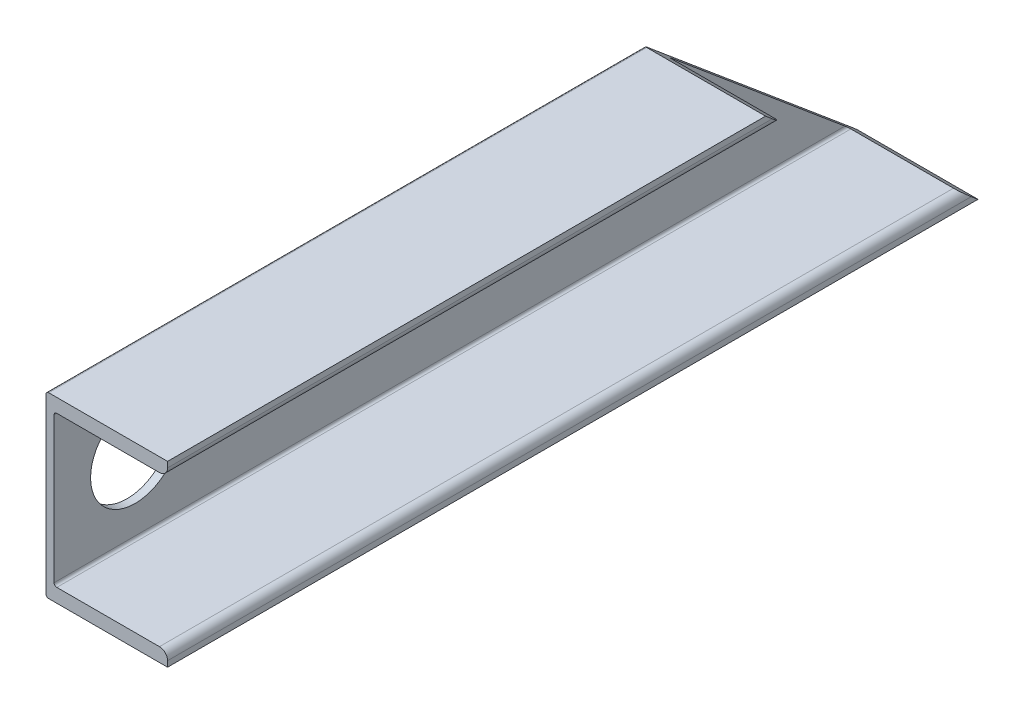
ISO-10303-21;
HEADER;
FILE_DESCRIPTION(('STEP AP214'),'2;1');
FILE_NAME('part.step','',(''),(''),'','','');
FILE_SCHEMA(('AUTOMOTIVE_DESIGN { 1 0 10303 214 1 1 1 1 }'));
ENDSEC;
DATA;
#1=APPLICATION_CONTEXT('core data for automotive mechanical design processes');
#2=APPLICATION_PROTOCOL_DEFINITION('international standard','automotive_design',2000,#1);
#3=PRODUCT_CONTEXT('',#1,'mechanical');
#4=PRODUCT('Part','Part','',(#3));
#5=PRODUCT_RELATED_PRODUCT_CATEGORY('part','',(#4));
#6=PRODUCT_DEFINITION_FORMATION('','',#4);
#7=PRODUCT_DEFINITION_CONTEXT('part definition',#1,'design');
#8=PRODUCT_DEFINITION('design','',#6,#7);
#9=PRODUCT_DEFINITION_SHAPE('','',#8);
#10=(LENGTH_UNIT() NAMED_UNIT(*) SI_UNIT(.MILLI.,.METRE.));
#11=(NAMED_UNIT(*) PLANE_ANGLE_UNIT() SI_UNIT($,.RADIAN.));
#12=(NAMED_UNIT(*) SI_UNIT($,.STERADIAN.) SOLID_ANGLE_UNIT());
#13=UNCERTAINTY_MEASURE_WITH_UNIT(LENGTH_MEASURE(1.E-05),#10,'distance_accuracy_value','');
#14=(GEOMETRIC_REPRESENTATION_CONTEXT(3) GLOBAL_UNCERTAINTY_ASSIGNED_CONTEXT((#13)) GLOBAL_UNIT_ASSIGNED_CONTEXT((#10,
#11,#12)) REPRESENTATION_CONTEXT('',''));
#15=CARTESIAN_POINT('',(0.,0.,0.));
#16=DIRECTION('',(0.,0.,1.));
#17=DIRECTION('',(1.,0.,0.));
#18=AXIS2_PLACEMENT_3D('',#15,#16,#17);
#19=CARTESIAN_POINT('',(3.00000000000002,-27.9,300.));
#20=DIRECTION('',(-1.,0.,0.));
#21=DIRECTION('',(0.,0.,1.));
#22=AXIS2_PLACEMENT_3D('',#19,#20,#21);
#23=PLANE('',#22);
#24=CARTESIAN_POINT('',(3.00000000000002,0.,270.));
#25=DIRECTION('',(-1.,0.,0.));
#26=DIRECTION('',(0.,0.,1.));
#27=AXIS2_PLACEMENT_3D('',#24,#25,#26);
#28=CIRCLE('',#27,16.5);
#29=CARTESIAN_POINT('',(3.00000000000002,0.,286.5));
#30=VERTEX_POINT('',#29);
#31=EDGE_CURVE('E165',#30,#30,#28,.T.);
#32=ORIENTED_EDGE('',*,*,#31,.T.);
#33=EDGE_LOOP('',(#32));
#34=FACE_BOUND('',#33,.T.);
#35=DIRECTION('',(0.,1.,0.));
#36=VECTOR('',#35,1.);
#37=CARTESIAN_POINT('',(3.00000000000002,-27.9,300.));
#38=LINE('',#37,#36);
#39=CARTESIAN_POINT('',(3.00000000000002,-26.9,300.));
#40=VERTEX_POINT('',#39);
#41=CARTESIAN_POINT('',(3.00000000000002,26.9,300.));
#42=VERTEX_POINT('',#41);
#43=EDGE_CURVE('E241',#40,#42,#38,.T.);
#44=ORIENTED_EDGE('',*,*,#43,.F.);
#45=DIRECTION('',(0.,0.,-1.));
#46=VECTOR('',#45,1.);
#47=CARTESIAN_POINT('',(3.00000000000002,-26.9,6.07794332223038));
#48=LINE('',#47,#46);
#49=CARTESIAN_POINT('',(3.00000000000002,-26.9,7.26969691482457));
#50=VERTEX_POINT('',#49);
#51=EDGE_CURVE('E195',#40,#50,#48,.T.);
#52=ORIENTED_EDGE('',*,*,#51,.T.);
#53=DIRECTION('',(0.,-0.642787609686544,-0.766044443118975));
#54=VECTOR('',#53,1.);
#55=CARTESIAN_POINT('',(3.00000000000002,33.,78.655737111217));
#56=LINE('',#55,#54);
#57=CARTESIAN_POINT('',(3.00000000000002,26.9,71.3860401963924));
#58=VERTEX_POINT('',#57);
#59=EDGE_CURVE('E225',#58,#50,#56,.T.);
#60=ORIENTED_EDGE('',*,*,#59,.F.);
#61=DIRECTION('',(0.,0.,-1.));
#62=VECTOR('',#61,1.);
#63=CARTESIAN_POINT('',(3.00000000000002,26.9,300.));
#64=LINE('',#63,#62);
#65=EDGE_CURVE('E193',#58,#42,#64,.F.);
#66=ORIENTED_EDGE('',*,*,#65,.T.);
#67=EDGE_LOOP('',(#44,#52,#60,#66));
#68=FACE_BOUND('',#67,.T.);
#69=ADVANCED_FACE('F44',(#34,#68),#23,.F.);
#70=CARTESIAN_POINT('',(3.00000000000002,27.9,300.));
#71=DIRECTION('',(0.,1.,0.));
#72=DIRECTION('',(0.,0.,1.));
#73=AXIS2_PLACEMENT_3D('',#70,#71,#72);
#74=PLANE('',#73);
#75=DIRECTION('',(1.,0.,0.));
#76=VECTOR('',#75,1.);
#77=CARTESIAN_POINT('',(3.00000000000002,27.9,300.));
#78=LINE('',#77,#76);
#79=CARTESIAN_POINT('',(4.00000000000002,27.9,300.));
#80=VERTEX_POINT('',#79);
#81=CARTESIAN_POINT('',(42.,27.9,300.));
#82=VERTEX_POINT('',#81);
#83=EDGE_CURVE('E238',#80,#82,#78,.T.);
#84=ORIENTED_EDGE('',*,*,#83,.F.);
#85=DIRECTION('',(0.,0.,-1.));
#86=VECTOR('',#85,1.);
#87=CARTESIAN_POINT('',(4.00000000000002,27.9,72.5777937889866));
#88=LINE('',#87,#86);
#89=CARTESIAN_POINT('',(4.00000000000002,27.9,72.5777937889866));
#90=VERTEX_POINT('',#89);
#91=EDGE_CURVE('E216',#80,#90,#88,.T.);
#92=ORIENTED_EDGE('',*,*,#91,.T.);
#93=DIRECTION('',(-1.,0.,0.));
#94=VECTOR('',#93,1.);
#95=CARTESIAN_POINT('',(45.001,27.9,72.5777937889866));
#96=LINE('',#95,#94);
#97=CARTESIAN_POINT('',(42.,27.9,72.5777937889866));
#98=VERTEX_POINT('',#97);
#99=EDGE_CURVE('E227',#98,#90,#96,.T.);
#100=ORIENTED_EDGE('',*,*,#99,.F.);
#101=DIRECTION('',(0.,0.,-1.));
#102=VECTOR('',#101,1.);
#103=CARTESIAN_POINT('',(42.,27.9,300.));
#104=LINE('',#103,#102);
#105=EDGE_CURVE('E190',#98,#82,#104,.F.);
#106=ORIENTED_EDGE('',*,*,#105,.T.);
#107=EDGE_LOOP('',(#84,#92,#100,#106));
#108=FACE_BOUND('',#107,.T.);
#109=ADVANCED_FACE('F236',(#108),#74,.F.);
#110=CARTESIAN_POINT('',(45.,27.9,300.));
#111=DIRECTION('',(-1.,0.,0.));
#112=DIRECTION('',(0.,0.,1.));
#113=AXIS2_PLACEMENT_3D('',#110,#111,#112);
#114=PLANE('',#113);
#115=DIRECTION('',(0.,1.,0.));
#116=VECTOR('',#115,1.);
#117=CARTESIAN_POINT('',(45.,27.9,300.));
#118=LINE('',#117,#116);
#119=CARTESIAN_POINT('',(45.,30.9,300.));
#120=VERTEX_POINT('',#119);
#121=CARTESIAN_POINT('',(45.,33.,300.));
#122=VERTEX_POINT('',#121);
#123=EDGE_CURVE('E240',#120,#122,#118,.T.);
#124=ORIENTED_EDGE('',*,*,#123,.F.);
#125=DIRECTION('',(0.,0.,-1.));
#126=VECTOR('',#125,1.);
#127=CARTESIAN_POINT('',(45.,30.9,300.));
#128=LINE('',#127,#126);
#129=CARTESIAN_POINT('',(45.,30.9,76.1530545667692));
#130=VERTEX_POINT('',#129);
#131=EDGE_CURVE('E163',#120,#130,#128,.T.);
#132=ORIENTED_EDGE('',*,*,#131,.T.);
#133=DIRECTION('',(0.,-0.642787609686544,-0.766044443118975));
#134=VECTOR('',#133,1.);
#135=CARTESIAN_POINT('',(45.,33.,78.655737111217));
#136=LINE('',#135,#134);
#137=CARTESIAN_POINT('',(45.,33.,78.655737111217));
#138=VERTEX_POINT('',#137);
#139=EDGE_CURVE('E149',#138,#130,#136,.T.);
#140=ORIENTED_EDGE('',*,*,#139,.F.);
#141=DIRECTION('',(0.,0.,-1.));
#142=VECTOR('',#141,1.);
#143=CARTESIAN_POINT('',(45.,33.,300.));
#144=LINE('',#143,#142);
#145=EDGE_CURVE('E161',#122,#138,#144,.T.);
#146=ORIENTED_EDGE('',*,*,#145,.F.);
#147=EDGE_LOOP('',(#124,#132,#140,#146));
#148=FACE_BOUND('',#147,.T.);
#149=ADVANCED_FACE('F160',(#148),#114,.F.);
#150=CARTESIAN_POINT('',(0.,33.,300.));
#151=DIRECTION('',(0.,-1.,0.));
#152=DIRECTION('',(0.,0.,-1.));
#153=AXIS2_PLACEMENT_3D('',#150,#151,#152);
#154=PLANE('',#153);
#155=DIRECTION('',(-1.,0.,0.));
#156=VECTOR('',#155,1.);
#157=CARTESIAN_POINT('',(45.001,33.,78.655737111217));
#158=LINE('',#157,#156);
#159=CARTESIAN_POINT('',(0.999999999999987,33.,78.655737111217));
#160=VERTEX_POINT('',#159);
#161=EDGE_CURVE('E145',#138,#160,#158,.T.);
#162=ORIENTED_EDGE('',*,*,#161,.T.);
#163=DIRECTION('',(0.,0.,-1.));
#164=VECTOR('',#163,1.);
#165=CARTESIAN_POINT('',(0.99999999999999,33.,300.));
#166=LINE('',#165,#164);
#167=CARTESIAN_POINT('',(0.99999999999999,33.,300.));
#168=VERTEX_POINT('',#167);
#169=EDGE_CURVE('E59',#160,#168,#166,.F.);
#170=ORIENTED_EDGE('',*,*,#169,.T.);
#171=DIRECTION('',(-1.,0.,0.));
#172=VECTOR('',#171,1.);
#173=CARTESIAN_POINT('',(0.,33.,300.));
#174=LINE('',#173,#172);
#175=EDGE_CURVE('E168',#122,#168,#174,.T.);
#176=ORIENTED_EDGE('',*,*,#175,.F.);
#177=ORIENTED_EDGE('',*,*,#145,.T.);
#178=EDGE_LOOP('',(#162,#170,#176,#177));
#179=FACE_BOUND('',#178,.T.);
#180=ADVANCED_FACE('F167',(#179),#154,.F.);
#181=CARTESIAN_POINT('',(0.,33.,300.));
#182=DIRECTION('',(1.,0.,0.));
#183=DIRECTION('',(0.,1.,0.));
#184=AXIS2_PLACEMENT_3D('',#181,#182,#183);
#185=PLANE('',#184);
#186=CARTESIAN_POINT('',(0.,0.,270.));
#187=DIRECTION('',(-1.,0.,0.));
#188=DIRECTION('',(0.,-1.,0.));
#189=AXIS2_PLACEMENT_3D('',#186,#187,#188);
#190=CIRCLE('',#189,16.5);
#191=CARTESIAN_POINT('',(0.,-16.5,270.));
#192=VERTEX_POINT('',#191);
#193=EDGE_CURVE('E477',#192,#192,#190,.T.);
#194=ORIENTED_EDGE('',*,*,#193,.F.);
#195=EDGE_LOOP('',(#194));
#196=FACE_BOUND('',#195,.T.);
#197=DIRECTION('',(0.,0.642787609686544,0.766044443118975));
#198=VECTOR('',#197,1.);
#199=CARTESIAN_POINT('',(0.,33.,78.655737111217));
#200=LINE('',#199,#198);
#201=CARTESIAN_POINT('',(0.,-32.,1.19175359259419));
#202=VERTEX_POINT('',#201);
#203=CARTESIAN_POINT('',(0.,32.,77.4639835186228));
#204=VERTEX_POINT('',#203);
#205=EDGE_CURVE('E154',#202,#204,#200,.T.);
#206=ORIENTED_EDGE('',*,*,#205,.F.);
#207=DIRECTION('',(0.,0.,-1.));
#208=VECTOR('',#207,1.);
#209=CARTESIAN_POINT('',(0.,-32.,300.));
#210=LINE('',#209,#208);
#211=CARTESIAN_POINT('',(0.,-32.,300.));
#212=VERTEX_POINT('',#211);
#213=EDGE_CURVE('E209',#202,#212,#210,.F.);
#214=ORIENTED_EDGE('',*,*,#213,.T.);
#215=DIRECTION('',(0.,-1.,0.));
#216=VECTOR('',#215,1.);
#217=CARTESIAN_POINT('',(0.,33.,300.));
#218=LINE('',#217,#216);
#219=CARTESIAN_POINT('',(0.,32.,300.));
#220=VERTEX_POINT('',#219);
#221=EDGE_CURVE('E247',#220,#212,#218,.T.);
#222=ORIENTED_EDGE('',*,*,#221,.F.);
#223=DIRECTION('',(0.,0.,-1.));
#224=VECTOR('',#223,1.);
#225=CARTESIAN_POINT('',(0.,32.,300.));
#226=LINE('',#225,#224);
#227=EDGE_CURVE('E206',#220,#204,#226,.T.);
#228=ORIENTED_EDGE('',*,*,#227,.T.);
#229=EDGE_LOOP('',(#206,#214,#222,#228));
#230=FACE_BOUND('',#229,.T.);
#231=ADVANCED_FACE('F290',(#196,#230),#185,.F.);
#232=CARTESIAN_POINT('',(0.,-33.,300.));
#233=DIRECTION('',(0.,1.,0.));
#234=DIRECTION('',(0.,0.,1.));
#235=AXIS2_PLACEMENT_3D('',#232,#233,#234);
#236=PLANE('',#235);
#237=DIRECTION('',(1.,0.,0.));
#238=VECTOR('',#237,1.);
#239=CARTESIAN_POINT('',(0.,-33.,300.));
#240=LINE('',#239,#238);
#241=CARTESIAN_POINT('',(1.00000000000001,-33.,300.));
#242=VERTEX_POINT('',#241);
#243=CARTESIAN_POINT('',(45.,-33.,300.));
#244=VERTEX_POINT('',#243);
#245=EDGE_CURVE('E250',#242,#244,#240,.T.);
#246=ORIENTED_EDGE('',*,*,#245,.F.);
#247=DIRECTION('',(0.,0.,-1.));
#248=VECTOR('',#247,1.);
#249=CARTESIAN_POINT('',(1.00000000000001,-33.,300.));
#250=LINE('',#249,#248);
#251=CARTESIAN_POINT('',(1.00000000000001,-33.,0.));
#252=VERTEX_POINT('',#251);
#253=EDGE_CURVE('E200',#242,#252,#250,.T.);
#254=ORIENTED_EDGE('',*,*,#253,.T.);
#255=DIRECTION('',(1.,0.,0.));
#256=VECTOR('',#255,1.);
#257=CARTESIAN_POINT('',(0.,-33.,0.));
#258=LINE('',#257,#256);
#259=CARTESIAN_POINT('',(45.,-33.,0.));
#260=VERTEX_POINT('',#259);
#261=EDGE_CURVE('E153',#252,#260,#258,.T.);
#262=ORIENTED_EDGE('',*,*,#261,.T.);
#263=DIRECTION('',(0.,0.,-1.));
#264=VECTOR('',#263,1.);
#265=CARTESIAN_POINT('',(45.,-33.,300.));
#266=LINE('',#265,#264);
#267=EDGE_CURVE('E170',#244,#260,#266,.T.);
#268=ORIENTED_EDGE('',*,*,#267,.F.);
#269=EDGE_LOOP('',(#246,#254,#262,#268));
#270=FACE_BOUND('',#269,.T.);
#271=ADVANCED_FACE('F260',(#270),#236,.F.);
#272=CARTESIAN_POINT('',(45.,-33.,300.));
#273=DIRECTION('',(-1.,0.,0.));
#274=DIRECTION('',(0.,0.,1.));
#275=AXIS2_PLACEMENT_3D('',#272,#273,#274);
#276=PLANE('',#275);
#277=DIRECTION('',(0.,-0.642787609686544,-0.766044443118975));
#278=VECTOR('',#277,1.);
#279=CARTESIAN_POINT('',(45.,33.,78.655737111217));
#280=LINE('',#279,#278);
#281=CARTESIAN_POINT('',(45.,-30.9,2.50268254444778));
#282=VERTEX_POINT('',#281);
#283=EDGE_CURVE('E264',#282,#260,#280,.T.);
#284=ORIENTED_EDGE('',*,*,#283,.F.);
#285=DIRECTION('',(0.,0.,-1.));
#286=VECTOR('',#285,1.);
#287=CARTESIAN_POINT('',(45.,-30.9,300.));
#288=LINE('',#287,#286);
#289=CARTESIAN_POINT('',(45.,-30.9,300.));
#290=VERTEX_POINT('',#289);
#291=EDGE_CURVE('E183',#282,#290,#288,.F.);
#292=ORIENTED_EDGE('',*,*,#291,.T.);
#293=DIRECTION('',(0.,1.,0.));
#294=VECTOR('',#293,1.);
#295=CARTESIAN_POINT('',(45.,-33.,300.));
#296=LINE('',#295,#294);
#297=EDGE_CURVE('E252',#244,#290,#296,.T.);
#298=ORIENTED_EDGE('',*,*,#297,.F.);
#299=ORIENTED_EDGE('',*,*,#267,.T.);
#300=EDGE_LOOP('',(#284,#292,#298,#299));
#301=FACE_BOUND('',#300,.T.);
#302=ADVANCED_FACE('F269',(#301),#276,.F.);
#303=CARTESIAN_POINT('',(45.,-27.9,300.));
#304=DIRECTION('',(0.,-1.,0.));
#305=DIRECTION('',(0.,0.,-1.));
#306=AXIS2_PLACEMENT_3D('',#303,#304,#305);
#307=PLANE('',#306);
#308=DIRECTION('',(1.,0.,0.));
#309=VECTOR('',#308,1.);
#310=CARTESIAN_POINT('',(45.001,-27.9,6.07794332223041));
#311=LINE('',#310,#309);
#312=CARTESIAN_POINT('',(4.00000000000002,-27.9,6.07794332223041));
#313=VERTEX_POINT('',#312);
#314=CARTESIAN_POINT('',(42.,-27.9,6.07794332223041));
#315=VERTEX_POINT('',#314);
#316=EDGE_CURVE('E164',#313,#315,#311,.T.);
#317=ORIENTED_EDGE('',*,*,#316,.F.);
#318=DIRECTION('',(0.,0.,-1.));
#319=VECTOR('',#318,1.);
#320=CARTESIAN_POINT('',(4.00000000000002,-27.9,300.));
#321=LINE('',#320,#319);
#322=CARTESIAN_POINT('',(4.00000000000002,-27.9,300.));
#323=VERTEX_POINT('',#322);
#324=EDGE_CURVE('E198',#313,#323,#321,.F.);
#325=ORIENTED_EDGE('',*,*,#324,.T.);
#326=DIRECTION('',(-1.,0.,0.));
#327=VECTOR('',#326,1.);
#328=CARTESIAN_POINT('',(45.,-27.9,300.));
#329=LINE('',#328,#327);
#330=CARTESIAN_POINT('',(42.,-27.9,300.));
#331=VERTEX_POINT('',#330);
#332=EDGE_CURVE('E176',#331,#323,#329,.T.);
#333=ORIENTED_EDGE('',*,*,#332,.F.);
#334=DIRECTION('',(0.,0.,-1.));
#335=VECTOR('',#334,1.);
#336=CARTESIAN_POINT('',(42.,-27.9,300.));
#337=LINE('',#336,#335);
#338=EDGE_CURVE('E169',#331,#315,#337,.T.);
#339=ORIENTED_EDGE('',*,*,#338,.T.);
#340=EDGE_LOOP('',(#317,#325,#333,#339));
#341=FACE_BOUND('',#340,.T.);
#342=ADVANCED_FACE('F278',(#341),#307,.F.);
#343=CARTESIAN_POINT('',(0.,0.,300.));
#344=DIRECTION('',(0.,0.,-1.));
#345=DIRECTION('',(-1.,0.,0.));
#346=AXIS2_PLACEMENT_3D('',#343,#344,#345);
#347=PLANE('',#346);
#348=ORIENTED_EDGE('',*,*,#221,.T.);
#349=CARTESIAN_POINT('',(1.00000000000001,-32.,300.));
#350=DIRECTION('',(0.,0.,-1.));
#351=DIRECTION('',(-1.,0.,0.));
#352=AXIS2_PLACEMENT_3D('',#349,#350,#351);
#353=CIRCLE('',#352,1.);
#354=EDGE_CURVE('E213',#212,#242,#353,.F.);
#355=ORIENTED_EDGE('',*,*,#354,.T.);
#356=ORIENTED_EDGE('',*,*,#245,.T.);
#357=ORIENTED_EDGE('',*,*,#297,.T.);
#358=CARTESIAN_POINT('',(42.,-30.9,300.));
#359=DIRECTION('',(0.,0.,-1.));
#360=DIRECTION('',(-1.,0.,0.));
#361=AXIS2_PLACEMENT_3D('',#358,#359,#360);
#362=CIRCLE('',#361,3.);
#363=EDGE_CURVE('E187',#290,#331,#362,.F.);
#364=ORIENTED_EDGE('',*,*,#363,.T.);
#365=ORIENTED_EDGE('',*,*,#332,.T.);
#366=CARTESIAN_POINT('',(4.00000000000002,-26.9,300.));
#367=DIRECTION('',(0.,0.,-1.));
#368=DIRECTION('',(-1.,0.,0.));
#369=AXIS2_PLACEMENT_3D('',#366,#367,#368);
#370=CIRCLE('',#369,1.);
#371=EDGE_CURVE('E221',#323,#40,#370,.T.);
#372=ORIENTED_EDGE('',*,*,#371,.T.);
#373=ORIENTED_EDGE('',*,*,#43,.T.);
#374=CARTESIAN_POINT('',(4.00000000000002,26.9,300.));
#375=DIRECTION('',(0.,0.,-1.));
#376=DIRECTION('',(-1.,0.,0.));
#377=AXIS2_PLACEMENT_3D('',#374,#375,#376);
#378=CIRCLE('',#377,1.);
#379=EDGE_CURVE('E11',#42,#80,#378,.T.);
#380=ORIENTED_EDGE('',*,*,#379,.T.);
#381=ORIENTED_EDGE('',*,*,#83,.T.);
#382=CARTESIAN_POINT('',(42.,30.9,300.));
#383=DIRECTION('',(0.,0.,-1.));
#384=DIRECTION('',(-1.,0.,0.));
#385=AXIS2_PLACEMENT_3D('',#382,#383,#384);
#386=CIRCLE('',#385,3.);
#387=EDGE_CURVE('E185',#82,#120,#386,.F.);
#388=ORIENTED_EDGE('',*,*,#387,.T.);
#389=ORIENTED_EDGE('',*,*,#123,.T.);
#390=ORIENTED_EDGE('',*,*,#175,.T.);
#391=CARTESIAN_POINT('',(0.99999999999999,32.,300.));
#392=DIRECTION('',(0.,0.,-1.));
#393=DIRECTION('',(-1.,0.,0.));
#394=AXIS2_PLACEMENT_3D('',#391,#392,#393);
#395=CIRCLE('',#394,1.);
#396=EDGE_CURVE('E211',#168,#220,#395,.F.);
#397=ORIENTED_EDGE('',*,*,#396,.T.);
#398=EDGE_LOOP('',(#348,#355,#356,#357,#364,#365,#372,#373,#380,#381,#388,#389,#390,#397));
#399=FACE_BOUND('',#398,.T.);
#400=ADVANCED_FACE('F271',(#399),#347,.F.);
#401=CARTESIAN_POINT('',(45.001,33.,78.655737111217));
#402=DIRECTION('',(0.,-0.766044443118974,0.642787609686543));
#403=DIRECTION('',(0.,-0.642787609686544,-0.766044443118975));
#404=AXIS2_PLACEMENT_3D('',#401,#402,#403);
#405=PLANE('',#404);
#406=ORIENTED_EDGE('',*,*,#261,.F.);
#407=CARTESIAN_POINT('',(1.00000000000001,-32.,1.19175359259421));
#408=DIRECTION('',(0.,-0.766044443118974,0.642787609686543));
#409=DIRECTION('',(0.,-0.642787609686544,-0.766044443118975));
#410=AXIS2_PLACEMENT_3D('',#407,#408,#409);
#411=ELLIPSE('',#410,1.5557238268604,1.);
#412=EDGE_CURVE('E204',#252,#202,#411,.F.);
#413=ORIENTED_EDGE('',*,*,#412,.T.);
#414=ORIENTED_EDGE('',*,*,#205,.T.);
#415=CARTESIAN_POINT('',(0.99999999999999,32.,77.4639835186228));
#416=DIRECTION('',(0.,-0.766044443118974,0.642787609686543));
#417=DIRECTION('',(0.,-0.642787609686544,-0.766044443118975));
#418=AXIS2_PLACEMENT_3D('',#415,#416,#417);
#419=ELLIPSE('',#418,1.5557238268604,1.);
#420=EDGE_CURVE('E151',#204,#160,#419,.F.);
#421=ORIENTED_EDGE('',*,*,#420,.T.);
#422=ORIENTED_EDGE('',*,*,#161,.F.);
#423=ORIENTED_EDGE('',*,*,#139,.T.);
#424=CARTESIAN_POINT('',(42.,30.9,76.1530545667692));
#425=DIRECTION('',(0.,-0.766044443118974,0.642787609686543));
#426=DIRECTION('',(0.,-0.642787609686544,-0.766044443118975));
#427=AXIS2_PLACEMENT_3D('',#424,#425,#426);
#428=ELLIPSE('',#427,4.66717148058121,3.);
#429=EDGE_CURVE('E173',#130,#98,#428,.F.);
#430=ORIENTED_EDGE('',*,*,#429,.T.);
#431=ORIENTED_EDGE('',*,*,#99,.T.);
#432=CARTESIAN_POINT('',(4.00000000000002,26.9,71.3860401963924));
#433=DIRECTION('',(0.,-0.766044443118974,0.642787609686543));
#434=DIRECTION('',(0.,0.642787609686544,0.766044443118975));
#435=AXIS2_PLACEMENT_3D('',#432,#433,#434);
#436=ELLIPSE('',#435,1.5557238268604,1.);
#437=EDGE_CURVE('E52',#90,#58,#436,.T.);
#438=ORIENTED_EDGE('',*,*,#437,.T.);
#439=ORIENTED_EDGE('',*,*,#59,.T.);
#440=CARTESIAN_POINT('',(4.00000000000002,-26.9,7.2696969148246));
#441=DIRECTION('',(0.,-0.766044443118974,0.642787609686543));
#442=DIRECTION('',(0.,0.642787609686544,0.766044443118975));
#443=AXIS2_PLACEMENT_3D('',#440,#441,#442);
#444=ELLIPSE('',#443,1.5557238268604,1.);
#445=EDGE_CURVE('E219',#50,#313,#444,.T.);
#446=ORIENTED_EDGE('',*,*,#445,.T.);
#447=ORIENTED_EDGE('',*,*,#316,.T.);
#448=CARTESIAN_POINT('',(42.,-30.9,2.5026825444478));
#449=DIRECTION('',(0.,-0.766044443118974,0.642787609686543));
#450=DIRECTION('',(0.,-0.642787609686544,-0.766044443118975));
#451=AXIS2_PLACEMENT_3D('',#448,#449,#450);
#452=ELLIPSE('',#451,4.66717148058121,3.);
#453=EDGE_CURVE('E181',#315,#282,#452,.F.);
#454=ORIENTED_EDGE('',*,*,#453,.T.);
#455=ORIENTED_EDGE('',*,*,#283,.T.);
#456=EDGE_LOOP('',(#406,#413,#414,#421,#422,#423,#430,#431,#438,#439,#446,#447,#454,#455));
#457=FACE_BOUND('',#456,.T.);
#458=ADVANCED_FACE('F148',(#457),#405,.F.);
#459=CARTESIAN_POINT('',(42.,-30.9,300.));
#460=DIRECTION('',(0.,0.,-1.));
#461=DIRECTION('',(-1.,0.,0.));
#462=AXIS2_PLACEMENT_3D('',#459,#460,#461);
#463=CYLINDRICAL_SURFACE('',#462,3.);
#464=ORIENTED_EDGE('',*,*,#363,.F.);
#465=ORIENTED_EDGE('',*,*,#291,.F.);
#466=ORIENTED_EDGE('',*,*,#453,.F.);
#467=ORIENTED_EDGE('',*,*,#338,.F.);
#468=EDGE_LOOP('',(#464,#465,#466,#467));
#469=FACE_BOUND('',#468,.T.);
#470=ADVANCED_FACE('F275',(#469),#463,.T.);
#471=CARTESIAN_POINT('',(42.,30.9,300.));
#472=DIRECTION('',(0.,0.,-1.));
#473=DIRECTION('',(-1.,0.,0.));
#474=AXIS2_PLACEMENT_3D('',#471,#472,#473);
#475=CYLINDRICAL_SURFACE('',#474,3.);
#476=ORIENTED_EDGE('',*,*,#387,.F.);
#477=ORIENTED_EDGE('',*,*,#105,.F.);
#478=ORIENTED_EDGE('',*,*,#429,.F.);
#479=ORIENTED_EDGE('',*,*,#131,.F.);
#480=EDGE_LOOP('',(#476,#477,#478,#479));
#481=FACE_BOUND('',#480,.T.);
#482=ADVANCED_FACE('F318',(#481),#475,.T.);
#483=CARTESIAN_POINT('',(4.00000000000002,-26.9,300.));
#484=DIRECTION('',(0.,0.,1.));
#485=DIRECTION('',(1.,0.,0.));
#486=AXIS2_PLACEMENT_3D('',#483,#484,#485);
#487=CYLINDRICAL_SURFACE('',#486,1.);
#488=ORIENTED_EDGE('',*,*,#371,.F.);
#489=ORIENTED_EDGE('',*,*,#324,.F.);
#490=ORIENTED_EDGE('',*,*,#445,.F.);
#491=ORIENTED_EDGE('',*,*,#51,.F.);
#492=EDGE_LOOP('',(#488,#489,#490,#491));
#493=FACE_BOUND('',#492,.T.);
#494=ADVANCED_FACE('F282',(#493),#487,.F.);
#495=CARTESIAN_POINT('',(1.00000000000001,-32.,300.));
#496=DIRECTION('',(0.,0.,-1.));
#497=DIRECTION('',(-1.,0.,0.));
#498=AXIS2_PLACEMENT_3D('',#495,#496,#497);
#499=CYLINDRICAL_SURFACE('',#498,1.);
#500=ORIENTED_EDGE('',*,*,#354,.F.);
#501=ORIENTED_EDGE('',*,*,#213,.F.);
#502=ORIENTED_EDGE('',*,*,#412,.F.);
#503=ORIENTED_EDGE('',*,*,#253,.F.);
#504=EDGE_LOOP('',(#500,#501,#502,#503));
#505=FACE_BOUND('',#504,.T.);
#506=ADVANCED_FACE('F295',(#505),#499,.T.);
#507=CARTESIAN_POINT('',(0.99999999999999,32.,300.));
#508=DIRECTION('',(0.,0.,-1.));
#509=DIRECTION('',(-1.,0.,0.));
#510=AXIS2_PLACEMENT_3D('',#507,#508,#509);
#511=CYLINDRICAL_SURFACE('',#510,1.);
#512=ORIENTED_EDGE('',*,*,#396,.F.);
#513=ORIENTED_EDGE('',*,*,#169,.F.);
#514=ORIENTED_EDGE('',*,*,#420,.F.);
#515=ORIENTED_EDGE('',*,*,#227,.F.);
#516=EDGE_LOOP('',(#512,#513,#514,#515));
#517=FACE_BOUND('',#516,.T.);
#518=ADVANCED_FACE('F298',(#517),#511,.T.);
#519=CARTESIAN_POINT('',(4.00000000000002,26.9,300.));
#520=DIRECTION('',(0.,0.,1.));
#521=DIRECTION('',(1.,0.,0.));
#522=AXIS2_PLACEMENT_3D('',#519,#520,#521);
#523=CYLINDRICAL_SURFACE('',#522,1.);
#524=ORIENTED_EDGE('',*,*,#379,.F.);
#525=ORIENTED_EDGE('',*,*,#65,.F.);
#526=ORIENTED_EDGE('',*,*,#437,.F.);
#527=ORIENTED_EDGE('',*,*,#91,.F.);
#528=EDGE_LOOP('',(#524,#525,#526,#527));
#529=FACE_BOUND('',#528,.T.);
#530=ADVANCED_FACE('F46',(#529),#523,.F.);
#531=CARTESIAN_POINT('',(10.,0.,270.));
#532=DIRECTION('',(-1.,0.,0.));
#533=DIRECTION('',(0.,-1.,0.));
#534=AXIS2_PLACEMENT_3D('',#531,#532,#533);
#535=CYLINDRICAL_SURFACE('',#534,16.5);
#536=ORIENTED_EDGE('',*,*,#193,.T.);
#537=EDGE_LOOP('',(#536));
#538=FACE_BOUND('',#537,.T.);
#539=ORIENTED_EDGE('',*,*,#31,.F.);
#540=EDGE_LOOP('',(#539));
#541=FACE_BOUND('',#540,.T.);
#542=ADVANCED_FACE('F304',(#538,#541),#535,.F.);
#543=CLOSED_SHELL('',(#69,#109,#149,#180,#231,#271,#302,#342,#400,#458,#470,#482,#494,#506,#518,
#530,#542));
#544=MANIFOLD_SOLID_BREP('B2',#543);
#545=ADVANCED_BREP_SHAPE_REPRESENTATION('',(#18,#544),#14);
#546=SHAPE_DEFINITION_REPRESENTATION(#9,#545);
ENDSEC;
END-ISO-10303-21;
